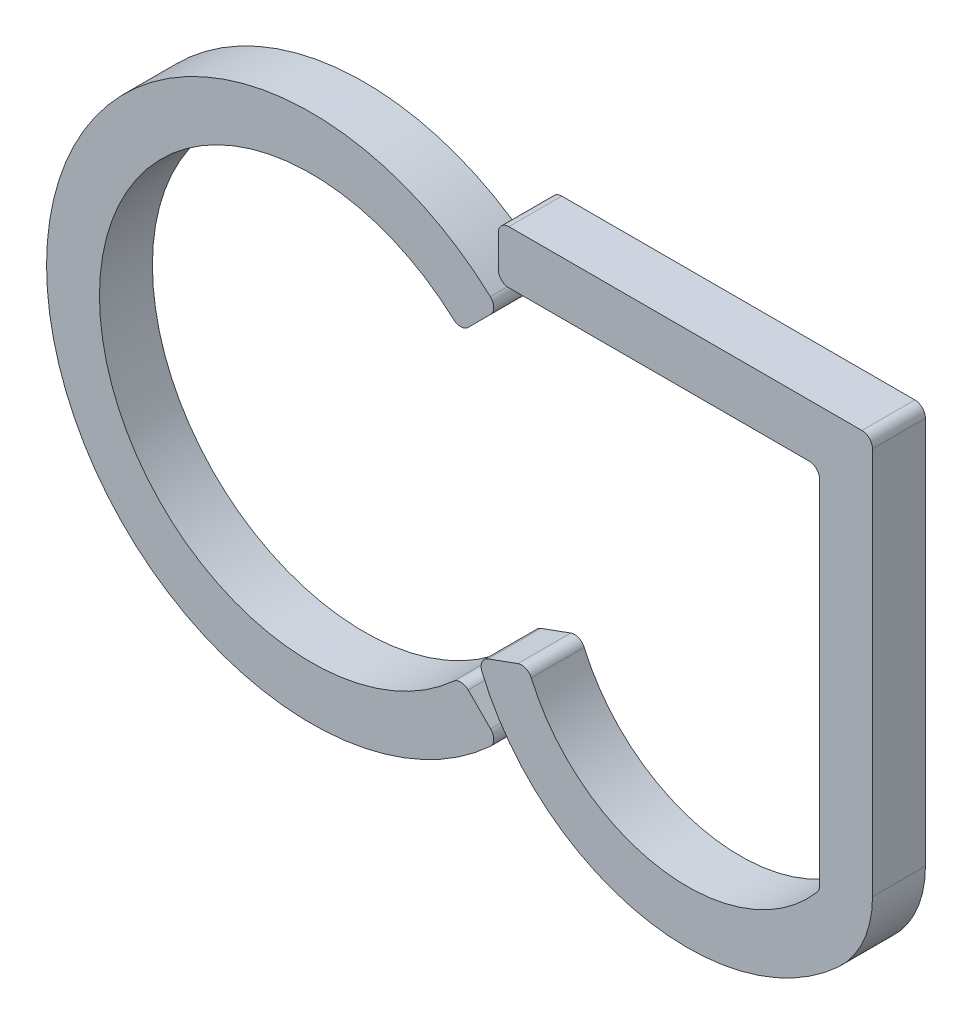
ISO-10303-21;
HEADER;
FILE_DESCRIPTION(('STEP AP214'),'2;1');
FILE_NAME('part.step','',(''),(''),'','','');
FILE_SCHEMA(('AUTOMOTIVE_DESIGN { 1 0 10303 214 1 1 1 1 }'));
ENDSEC;
DATA;
#1=APPLICATION_CONTEXT('core data for automotive mechanical design processes');
#2=APPLICATION_PROTOCOL_DEFINITION('international standard','automotive_design',2000,#1);
#3=PRODUCT_CONTEXT('',#1,'mechanical');
#4=PRODUCT('Part','Part','',(#3));
#5=PRODUCT_RELATED_PRODUCT_CATEGORY('part','',(#4));
#6=PRODUCT_DEFINITION_FORMATION('','',#4);
#7=PRODUCT_DEFINITION_CONTEXT('part definition',#1,'design');
#8=PRODUCT_DEFINITION('design','',#6,#7);
#9=PRODUCT_DEFINITION_SHAPE('','',#8);
#10=(LENGTH_UNIT() NAMED_UNIT(*) SI_UNIT(.MILLI.,.METRE.));
#11=(NAMED_UNIT(*) PLANE_ANGLE_UNIT() SI_UNIT($,.RADIAN.));
#12=(NAMED_UNIT(*) SI_UNIT($,.STERADIAN.) SOLID_ANGLE_UNIT());
#13=UNCERTAINTY_MEASURE_WITH_UNIT(LENGTH_MEASURE(1.E-05),#10,'distance_accuracy_value','');
#14=(GEOMETRIC_REPRESENTATION_CONTEXT(3) GLOBAL_UNCERTAINTY_ASSIGNED_CONTEXT((#13)) GLOBAL_UNIT_ASSIGNED_CONTEXT((#10,
#11,#12)) REPRESENTATION_CONTEXT('',''));
#15=CARTESIAN_POINT('',(0.,0.,0.));
#16=DIRECTION('',(0.,0.,1.));
#17=DIRECTION('',(1.,0.,0.));
#18=AXIS2_PLACEMENT_3D('',#15,#16,#17);
#19=CARTESIAN_POINT('',(106.070861158033,50.,10.));
#20=DIRECTION('',(-1.,0.,0.));
#21=DIRECTION('',(0.,-1.,0.));
#22=AXIS2_PLACEMENT_3D('',#19,#20,#21);
#23=PLANE('',#22);
#24=DIRECTION('',(0.,1.,0.));
#25=VECTOR('',#24,1.);
#26=CARTESIAN_POINT('',(106.070861158033,50.,0.));
#27=LINE('',#26,#25);
#28=CARTESIAN_POINT('',(106.070861158033,-25.2968402151556,0.));
#29=VERTEX_POINT('',#28);
#30=CARTESIAN_POINT('',(106.070861158033,48.,0.));
#31=VERTEX_POINT('',#30);
#32=EDGE_CURVE('E175',#29,#31,#27,.T.);
#33=ORIENTED_EDGE('',*,*,#32,.T.);
#34=DIRECTION('',(0.,0.,-1.));
#35=VECTOR('',#34,1.);
#36=CARTESIAN_POINT('',(106.070861158033,48.,10.));
#37=LINE('',#36,#35);
#38=CARTESIAN_POINT('',(106.070861158033,48.,10.));
#39=VERTEX_POINT('',#38);
#40=EDGE_CURVE('E215',#31,#39,#37,.F.);
#41=ORIENTED_EDGE('',*,*,#40,.T.);
#42=DIRECTION('',(0.,1.,0.));
#43=VECTOR('',#42,1.);
#44=CARTESIAN_POINT('',(106.070861158033,50.,10.));
#45=LINE('',#44,#43);
#46=CARTESIAN_POINT('',(106.070861158033,-25.2968402151556,10.));
#47=VERTEX_POINT('',#46);
#48=EDGE_CURVE('E178',#47,#39,#45,.T.);
#49=ORIENTED_EDGE('',*,*,#48,.F.);
#50=DIRECTION('',(0.,0.,-1.));
#51=VECTOR('',#50,1.);
#52=CARTESIAN_POINT('',(106.070861158033,-25.2968402151556,10.));
#53=LINE('',#52,#51);
#54=EDGE_CURVE('E165',#47,#29,#53,.T.);
#55=ORIENTED_EDGE('',*,*,#54,.T.);
#56=EDGE_LOOP('',(#33,#41,#49,#55));
#57=FACE_BOUND('',#56,.T.);
#58=ADVANCED_FACE('F45',(#57),#23,.F.);
#59=CARTESIAN_POINT('',(35.3553390593273,50.,10.));
#60=DIRECTION('',(0.,-1.,0.));
#61=DIRECTION('',(0.,0.,-1.));
#62=AXIS2_PLACEMENT_3D('',#59,#60,#61);
#63=PLANE('',#62);
#64=DIRECTION('',(-1.,0.,0.));
#65=VECTOR('',#64,1.);
#66=CARTESIAN_POINT('',(35.3553390593273,50.,0.));
#67=LINE('',#66,#65);
#68=CARTESIAN_POINT('',(104.070861158033,50.,0.));
#69=VERTEX_POINT('',#68);
#70=CARTESIAN_POINT('',(37.3553390593273,50.,0.));
#71=VERTEX_POINT('',#70);
#72=EDGE_CURVE('E185',#69,#71,#67,.T.);
#73=ORIENTED_EDGE('',*,*,#72,.T.);
#74=DIRECTION('',(0.,0.,-1.));
#75=VECTOR('',#74,1.);
#76=CARTESIAN_POINT('',(37.3553390593273,50.,10.));
#77=LINE('',#76,#75);
#78=CARTESIAN_POINT('',(37.3553390593273,50.,10.));
#79=VERTEX_POINT('',#78);
#80=EDGE_CURVE('E261',#71,#79,#77,.F.);
#81=ORIENTED_EDGE('',*,*,#80,.T.);
#82=DIRECTION('',(-1.,0.,0.));
#83=VECTOR('',#82,1.);
#84=CARTESIAN_POINT('',(35.3553390593273,50.,10.));
#85=LINE('',#84,#83);
#86=CARTESIAN_POINT('',(104.070861158033,50.,10.));
#87=VERTEX_POINT('',#86);
#88=EDGE_CURVE('E296',#87,#79,#85,.T.);
#89=ORIENTED_EDGE('',*,*,#88,.F.);
#90=DIRECTION('',(0.,0.,-1.));
#91=VECTOR('',#90,1.);
#92=CARTESIAN_POINT('',(104.070861158033,50.,10.));
#93=LINE('',#92,#91);
#94=EDGE_CURVE('E211',#87,#69,#93,.T.);
#95=ORIENTED_EDGE('',*,*,#94,.T.);
#96=EDGE_LOOP('',(#73,#81,#89,#95));
#97=FACE_BOUND('',#96,.T.);
#98=ADVANCED_FACE('F305',(#97),#63,.F.);
#99=CARTESIAN_POINT('',(35.3553390593273,50.,10.));
#100=DIRECTION('',(1.,0.,0.));
#101=DIRECTION('',(0.,0.,-1.));
#102=AXIS2_PLACEMENT_3D('',#99,#100,#101);
#103=PLANE('',#102);
#104=DIRECTION('',(0.,-1.,0.));
#105=VECTOR('',#104,1.);
#106=CARTESIAN_POINT('',(35.3553390593273,50.,0.));
#107=LINE('',#106,#105);
#108=CARTESIAN_POINT('',(35.3553390593273,48.,0.));
#109=VERTEX_POINT('',#108);
#110=CARTESIAN_POINT('',(35.3553390593273,42.,0.));
#111=VERTEX_POINT('',#110);
#112=EDGE_CURVE('E188',#109,#111,#107,.T.);
#113=ORIENTED_EDGE('',*,*,#112,.T.);
#114=DIRECTION('',(0.,0.,-1.));
#115=VECTOR('',#114,1.);
#116=CARTESIAN_POINT('',(35.3553390593273,42.,10.));
#117=LINE('',#116,#115);
#118=CARTESIAN_POINT('',(35.3553390593273,42.,10.));
#119=VERTEX_POINT('',#118);
#120=EDGE_CURVE('E68',#111,#119,#117,.F.);
#121=ORIENTED_EDGE('',*,*,#120,.T.);
#122=DIRECTION('',(0.,-1.,0.));
#123=VECTOR('',#122,1.);
#124=CARTESIAN_POINT('',(35.3553390593273,50.,10.));
#125=LINE('',#124,#123);
#126=CARTESIAN_POINT('',(35.3553390593273,48.,10.));
#127=VERTEX_POINT('',#126);
#128=EDGE_CURVE('E294',#127,#119,#125,.T.);
#129=ORIENTED_EDGE('',*,*,#128,.F.);
#130=DIRECTION('',(0.,0.,-1.));
#131=VECTOR('',#130,1.);
#132=CARTESIAN_POINT('',(35.3553390593273,48.,10.));
#133=LINE('',#132,#131);
#134=EDGE_CURVE('E257',#127,#109,#133,.T.);
#135=ORIENTED_EDGE('',*,*,#134,.T.);
#136=EDGE_LOOP('',(#113,#121,#129,#135));
#137=FACE_BOUND('',#136,.T.);
#138=ADVANCED_FACE('F311',(#137),#103,.F.);
#139=CARTESIAN_POINT('',(35.3553390593273,40.,10.));
#140=DIRECTION('',(0.,1.,0.));
#141=DIRECTION('',(0.,0.,1.));
#142=AXIS2_PLACEMENT_3D('',#139,#140,#141);
#143=PLANE('',#142);
#144=DIRECTION('',(1.,0.,0.));
#145=VECTOR('',#144,1.);
#146=CARTESIAN_POINT('',(35.3553390593273,40.,0.));
#147=LINE('',#146,#145);
#148=CARTESIAN_POINT('',(37.3553390593273,40.,0.));
#149=VERTEX_POINT('',#148);
#150=CARTESIAN_POINT('',(94.0708611580329,40.,0.));
#151=VERTEX_POINT('',#150);
#152=EDGE_CURVE('E194',#149,#151,#147,.T.);
#153=ORIENTED_EDGE('',*,*,#152,.T.);
#154=DIRECTION('',(0.,0.,-1.));
#155=VECTOR('',#154,1.);
#156=CARTESIAN_POINT('',(94.0708611580329,40.,10.));
#157=LINE('',#156,#155);
#158=CARTESIAN_POINT('',(94.0708611580329,40.,10.));
#159=VERTEX_POINT('',#158);
#160=EDGE_CURVE('E227',#151,#159,#157,.F.);
#161=ORIENTED_EDGE('',*,*,#160,.T.);
#162=DIRECTION('',(1.,0.,0.));
#163=VECTOR('',#162,1.);
#164=CARTESIAN_POINT('',(35.3553390593273,40.,10.));
#165=LINE('',#164,#163);
#166=CARTESIAN_POINT('',(37.3553390593273,40.,10.));
#167=VERTEX_POINT('',#166);
#168=EDGE_CURVE('E289',#167,#159,#165,.T.);
#169=ORIENTED_EDGE('',*,*,#168,.F.);
#170=DIRECTION('',(0.,0.,-1.));
#171=VECTOR('',#170,1.);
#172=CARTESIAN_POINT('',(37.3553390593273,40.,10.));
#173=LINE('',#172,#171);
#174=EDGE_CURVE('E224',#167,#149,#173,.T.);
#175=ORIENTED_EDGE('',*,*,#174,.T.);
#176=EDGE_LOOP('',(#153,#161,#169,#175));
#177=FACE_BOUND('',#176,.T.);
#178=ADVANCED_FACE('F319',(#177),#143,.F.);
#179=CARTESIAN_POINT('',(96.0708611580329,40.,10.));
#180=DIRECTION('',(1.,0.,0.));
#181=DIRECTION('',(0.,0.,-1.));
#182=AXIS2_PLACEMENT_3D('',#179,#180,#181);
#183=PLANE('',#182);
#184=DIRECTION('',(0.,-1.,0.));
#185=VECTOR('',#184,1.);
#186=CARTESIAN_POINT('',(96.0708611580329,40.,10.));
#187=LINE('',#186,#185);
#188=CARTESIAN_POINT('',(96.0708611580329,38.,10.));
#189=VERTEX_POINT('',#188);
#190=CARTESIAN_POINT('',(96.0708611580329,-28.4975287566822,10.));
#191=VERTEX_POINT('',#190);
#192=EDGE_CURVE('E283',#189,#191,#187,.T.);
#193=ORIENTED_EDGE('',*,*,#192,.F.);
#194=DIRECTION('',(0.,0.,-1.));
#195=VECTOR('',#194,1.);
#196=CARTESIAN_POINT('',(96.0708611580329,38.,0.));
#197=LINE('',#196,#195);
#198=CARTESIAN_POINT('',(96.0708611580329,38.,0.));
#199=VERTEX_POINT('',#198);
#200=EDGE_CURVE('E221',#189,#199,#197,.T.);
#201=ORIENTED_EDGE('',*,*,#200,.T.);
#202=DIRECTION('',(0.,-1.,0.));
#203=VECTOR('',#202,1.);
#204=CARTESIAN_POINT('',(96.0708611580329,40.,0.));
#205=LINE('',#204,#203);
#206=CARTESIAN_POINT('',(96.0708611580329,-28.4975287566822,0.));
#207=VERTEX_POINT('',#206);
#208=EDGE_CURVE('E197',#199,#207,#205,.T.);
#209=ORIENTED_EDGE('',*,*,#208,.T.);
#210=DIRECTION('',(0.,0.,1.));
#211=VECTOR('',#210,1.);
#212=CARTESIAN_POINT('',(96.0708611580329,-28.4975287566822,10.));
#213=LINE('',#212,#211);
#214=EDGE_CURVE('E219',#207,#191,#213,.T.);
#215=ORIENTED_EDGE('',*,*,#214,.T.);
#216=EDGE_LOOP('',(#193,#201,#209,#215));
#217=FACE_BOUND('',#216,.T.);
#218=ADVANCED_FACE('F273',(#217),#183,.F.);
#219=CARTESIAN_POINT('',(71.0951118170808,-8.98994818030341,10.));
#220=DIRECTION('',(0.,0.,-1.));
#221=DIRECTION('',(-1.,0.,0.));
#222=AXIS2_PLACEMENT_3D('',#219,#220,#221);
#223=CYLINDRICAL_SURFACE('',#222,32.140185097676);
#224=CARTESIAN_POINT('',(71.0951118170808,-8.98994818030341,10.));
#225=DIRECTION('',(0.,0.,-1.));
#226=DIRECTION('',(1.,0.,0.));
#227=AXIS2_PLACEMENT_3D('',#224,#225,#226);
#228=CIRCLE('',#227,32.140185097676);
#229=CARTESIAN_POINT('',(95.5954536093728,-29.7919853443348,10.));
#230=VERTEX_POINT('',#229);
#231=CARTESIAN_POINT('',(41.5890536152692,-21.732947336867,10.));
#232=VERTEX_POINT('',#231);
#233=EDGE_CURVE('E281',#230,#232,#228,.T.);
#234=ORIENTED_EDGE('',*,*,#233,.F.);
#235=DIRECTION('',(0.,0.,-1.));
#236=VECTOR('',#235,1.);
#237=CARTESIAN_POINT('',(95.5954536093728,-29.7919853443348,10.));
#238=LINE('',#237,#236);
#239=CARTESIAN_POINT('',(95.5954536093728,-29.7919853443348,0.));
#240=VERTEX_POINT('',#239);
#241=EDGE_CURVE('E231',#230,#240,#238,.T.);
#242=ORIENTED_EDGE('',*,*,#241,.T.);
#243=CARTESIAN_POINT('',(71.0951118170808,-8.98994818030341,0.));
#244=DIRECTION('',(0.,0.,-1.));
#245=DIRECTION('',(1.,0.,0.));
#246=AXIS2_PLACEMENT_3D('',#243,#244,#245);
#247=CIRCLE('',#246,32.140185097676);
#248=CARTESIAN_POINT('',(41.5890536152692,-21.732947336867,0.));
#249=VERTEX_POINT('',#248);
#250=EDGE_CURVE('E200',#240,#249,#247,.T.);
#251=ORIENTED_EDGE('',*,*,#250,.T.);
#252=DIRECTION('',(0.,0.,-1.));
#253=VECTOR('',#252,1.);
#254=CARTESIAN_POINT('',(41.5890536152692,-21.732947336867,10.));
#255=LINE('',#254,#253);
#256=EDGE_CURVE('E229',#249,#232,#255,.F.);
#257=ORIENTED_EDGE('',*,*,#256,.T.);
#258=EDGE_LOOP('',(#234,#242,#251,#257));
#259=FACE_BOUND('',#258,.T.);
#260=ADVANCED_FACE('F285',(#259),#223,.F.);
#261=CARTESIAN_POINT('',(40.8932170501014,-19.9825388939239,10.));
#262=DIRECTION('',(0.342020143325663,-0.93969262078591,0.));
#263=DIRECTION('',(0.939692620785911,0.342020143325663,0.));
#264=AXIS2_PLACEMENT_3D('',#261,#262,#263);
#265=PLANE('',#264);
#266=DIRECTION('',(-0.93969262078591,-0.342020143325663,0.));
#267=VECTOR('',#266,1.);
#268=CARTESIAN_POINT('',(40.8932170501014,-19.9825388939239,10.));
#269=LINE('',#268,#267);
#270=CARTESIAN_POINT('',(39.0689281839841,-20.6465257398938,10.));
#271=VERTEX_POINT('',#270);
#272=CARTESIAN_POINT('',(33.4225257212233,-22.7016481670261,10.));
#273=VERTEX_POINT('',#272);
#274=EDGE_CURVE('E287',#271,#273,#269,.T.);
#275=ORIENTED_EDGE('',*,*,#274,.F.);
#276=DIRECTION('',(0.,0.,-1.));
#277=VECTOR('',#276,1.);
#278=CARTESIAN_POINT('',(39.0689281839841,-20.6465257398938,10.));
#279=LINE('',#278,#277);
#280=CARTESIAN_POINT('',(39.0689281839841,-20.6465257398938,0.));
#281=VERTEX_POINT('',#280);
#282=EDGE_CURVE('E236',#271,#281,#279,.T.);
#283=ORIENTED_EDGE('',*,*,#282,.T.);
#284=DIRECTION('',(-0.93969262078591,-0.342020143325663,0.));
#285=VECTOR('',#284,1.);
#286=CARTESIAN_POINT('',(40.8932170501014,-19.9825388939239,0.));
#287=LINE('',#286,#285);
#288=CARTESIAN_POINT('',(33.4225257212233,-22.7016481670261,0.));
#289=VERTEX_POINT('',#288);
#290=EDGE_CURVE('E203',#281,#289,#287,.T.);
#291=ORIENTED_EDGE('',*,*,#290,.T.);
#292=DIRECTION('',(0.,0.,-1.));
#293=VECTOR('',#292,1.);
#294=CARTESIAN_POINT('',(33.4225257212233,-22.7016481670261,10.));
#295=LINE('',#294,#293);
#296=EDGE_CURVE('E234',#289,#273,#295,.F.);
#297=ORIENTED_EDGE('',*,*,#296,.T.);
#298=EDGE_LOOP('',(#275,#283,#291,#297));
#299=FACE_BOUND('',#298,.T.);
#300=ADVANCED_FACE('F354',(#299),#265,.F.);
#301=CARTESIAN_POINT('',(71.0951118170808,-8.98994818030341,10.));
#302=DIRECTION('',(0.,0.,-1.));
#303=DIRECTION('',(-1.,0.,0.));
#304=AXIS2_PLACEMENT_3D('',#301,#302,#303);
#305=CYLINDRICAL_SURFACE('',#304,42.140185097676);
#306=CARTESIAN_POINT('',(71.0951118170808,-8.98994818030341,10.));
#307=DIRECTION('',(0.,0.,1.));
#308=DIRECTION('',(1.,0.,0.));
#309=AXIS2_PLACEMENT_3D('',#306,#307,#308);
#310=CIRCLE('',#309,42.140185097676);
#311=CARTESIAN_POINT('',(32.2635976349486,-25.3578651641245,10.));
#312=VERTEX_POINT('',#311);
#313=CARTESIAN_POINT('',(99.5989769121546,-40.0274235078526,10.));
#314=VERTEX_POINT('',#313);
#315=EDGE_CURVE('E179',#312,#314,#310,.T.);
#316=ORIENTED_EDGE('',*,*,#315,.F.);
#317=DIRECTION('',(0.,0.,-1.));
#318=VECTOR('',#317,1.);
#319=CARTESIAN_POINT('',(32.2635976349486,-25.3578651641245,10.));
#320=LINE('',#319,#318);
#321=CARTESIAN_POINT('',(32.2635976349486,-25.3578651641245,0.));
#322=VERTEX_POINT('',#321);
#323=EDGE_CURVE('E254',#312,#322,#320,.T.);
#324=ORIENTED_EDGE('',*,*,#323,.T.);
#325=CARTESIAN_POINT('',(71.0951118170808,-8.98994818030341,0.));
#326=DIRECTION('',(0.,0.,1.));
#327=DIRECTION('',(1.,0.,0.));
#328=AXIS2_PLACEMENT_3D('',#325,#326,#327);
#329=CIRCLE('',#328,42.140185097676);
#330=CARTESIAN_POINT('',(99.5989769121546,-40.0274235078526,0.));
#331=VERTEX_POINT('',#330);
#332=EDGE_CURVE('E206',#322,#331,#329,.T.);
#333=ORIENTED_EDGE('',*,*,#332,.T.);
#334=DIRECTION('',(0.,0.,-1.));
#335=VECTOR('',#334,1.);
#336=CARTESIAN_POINT('',(99.5989769121546,-40.0274235078526,10.));
#337=LINE('',#336,#335);
#338=EDGE_CURVE('E167',#331,#314,#337,.F.);
#339=ORIENTED_EDGE('',*,*,#338,.T.);
#340=EDGE_LOOP('',(#316,#324,#333,#339));
#341=FACE_BOUND('',#340,.T.);
#342=ADVANCED_FACE('F349',(#341),#305,.T.);
#343=CARTESIAN_POINT('',(71.0951118170808,-8.98994818030341,10.));
#344=DIRECTION('',(0.,0.,1.));
#345=DIRECTION('',(1.,0.,0.));
#346=AXIS2_PLACEMENT_3D('',#343,#344,#345);
#347=PLANE('',#346);
#348=ORIENTED_EDGE('',*,*,#233,.T.);
#349=CARTESIAN_POINT('',(39.7529684706354,-22.5259109814656,10.));
#350=DIRECTION('',(0.,0.,1.));
#351=DIRECTION('',(1.,0.,0.));
#352=AXIS2_PLACEMENT_3D('',#349,#350,#351);
#353=CIRCLE('',#352,2.);
#354=EDGE_CURVE('E252',#232,#271,#353,.T.);
#355=ORIENTED_EDGE('',*,*,#354,.T.);
#356=ORIENTED_EDGE('',*,*,#274,.T.);
#357=CARTESIAN_POINT('',(34.1065660078746,-24.5810334085979,10.));
#358=DIRECTION('',(0.,0.,1.));
#359=DIRECTION('',(1.,0.,0.));
#360=AXIS2_PLACEMENT_3D('',#357,#358,#359);
#361=CIRCLE('',#360,2.);
#362=EDGE_CURVE('E60',#273,#312,#361,.T.);
#363=ORIENTED_EDGE('',*,*,#362,.T.);
#364=ORIENTED_EDGE('',*,*,#315,.T.);
#365=CARTESIAN_POINT('',(86.0708611580329,-25.2968402151557,10.));
#366=DIRECTION('',(0.,0.,1.));
#367=DIRECTION('',(1.,0.,0.));
#368=AXIS2_PLACEMENT_3D('',#365,#366,#367);
#369=CIRCLE('',#368,20.);
#370=EDGE_CURVE('E209',#314,#47,#369,.T.);
#371=ORIENTED_EDGE('',*,*,#370,.T.);
#372=ORIENTED_EDGE('',*,*,#48,.T.);
#373=CARTESIAN_POINT('',(104.070861158033,48.,10.));
#374=DIRECTION('',(0.,0.,1.));
#375=DIRECTION('',(1.,0.,0.));
#376=AXIS2_PLACEMENT_3D('',#373,#374,#375);
#377=CIRCLE('',#376,2.);
#378=EDGE_CURVE('E217',#39,#87,#377,.T.);
#379=ORIENTED_EDGE('',*,*,#378,.T.);
#380=ORIENTED_EDGE('',*,*,#88,.T.);
#381=CARTESIAN_POINT('',(37.3553390593273,48.,10.));
#382=DIRECTION('',(0.,0.,1.));
#383=DIRECTION('',(1.,0.,0.));
#384=AXIS2_PLACEMENT_3D('',#381,#382,#383);
#385=CIRCLE('',#384,2.);
#386=EDGE_CURVE('E247',#79,#127,#385,.T.);
#387=ORIENTED_EDGE('',*,*,#386,.T.);
#388=ORIENTED_EDGE('',*,*,#128,.T.);
#389=CARTESIAN_POINT('',(37.3553390593273,42.,10.));
#390=DIRECTION('',(0.,0.,1.));
#391=DIRECTION('',(1.,0.,0.));
#392=AXIS2_PLACEMENT_3D('',#389,#390,#391);
#393=CIRCLE('',#392,2.);
#394=EDGE_CURVE('E249',#119,#167,#393,.T.);
#395=ORIENTED_EDGE('',*,*,#394,.T.);
#396=ORIENTED_EDGE('',*,*,#168,.T.);
#397=CARTESIAN_POINT('',(94.0708611580329,38.,10.));
#398=DIRECTION('',(0.,0.,1.));
#399=DIRECTION('',(1.,0.,0.));
#400=AXIS2_PLACEMENT_3D('',#397,#398,#399);
#401=CIRCLE('',#400,2.);
#402=EDGE_CURVE('E265',#159,#189,#401,.F.);
#403=ORIENTED_EDGE('',*,*,#402,.T.);
#404=ORIENTED_EDGE('',*,*,#192,.T.);
#405=CARTESIAN_POINT('',(94.0708611580329,-28.4975287566822,10.));
#406=DIRECTION('',(0.,0.,1.));
#407=DIRECTION('',(1.,0.,0.));
#408=AXIS2_PLACEMENT_3D('',#405,#406,#407);
#409=CIRCLE('',#408,2.);
#410=EDGE_CURVE('E12',#191,#230,#409,.F.);
#411=ORIENTED_EDGE('',*,*,#410,.T.);
#412=EDGE_LOOP('',(#348,#355,#356,#363,#364,#371,#372,#379,#380,#387,#388,#395,#396,#403,#404,#411));
#413=FACE_BOUND('',#412,.T.);
#414=ADVANCED_FACE('F280',(#413),#347,.T.);
#415=CARTESIAN_POINT('',(71.0951118170808,-8.98994818030341,0.));
#416=DIRECTION('',(0.,0.,1.));
#417=DIRECTION('',(1.,0.,0.));
#418=AXIS2_PLACEMENT_3D('',#415,#416,#417);
#419=PLANE('',#418);
#420=ORIENTED_EDGE('',*,*,#290,.F.);
#421=CARTESIAN_POINT('',(39.7529684706354,-22.5259109814656,0.));
#422=DIRECTION('',(0.,0.,1.));
#423=DIRECTION('',(1.,0.,0.));
#424=AXIS2_PLACEMENT_3D('',#421,#422,#423);
#425=CIRCLE('',#424,2.);
#426=EDGE_CURVE('E245',#281,#249,#425,.F.);
#427=ORIENTED_EDGE('',*,*,#426,.T.);
#428=ORIENTED_EDGE('',*,*,#250,.F.);
#429=CARTESIAN_POINT('',(94.0708611580329,-28.4975287566822,0.));
#430=DIRECTION('',(0.,0.,1.));
#431=DIRECTION('',(1.,0.,0.));
#432=AXIS2_PLACEMENT_3D('',#429,#430,#431);
#433=CIRCLE('',#432,2.);
#434=EDGE_CURVE('E53',#240,#207,#433,.T.);
#435=ORIENTED_EDGE('',*,*,#434,.T.);
#436=ORIENTED_EDGE('',*,*,#208,.F.);
#437=CARTESIAN_POINT('',(94.0708611580329,38.,0.));
#438=DIRECTION('',(0.,0.,1.));
#439=DIRECTION('',(1.,0.,0.));
#440=AXIS2_PLACEMENT_3D('',#437,#438,#439);
#441=CIRCLE('',#440,2.);
#442=EDGE_CURVE('E263',#199,#151,#441,.T.);
#443=ORIENTED_EDGE('',*,*,#442,.T.);
#444=ORIENTED_EDGE('',*,*,#152,.F.);
#445=CARTESIAN_POINT('',(37.3553390593273,42.,0.));
#446=DIRECTION('',(0.,0.,1.));
#447=DIRECTION('',(1.,0.,0.));
#448=AXIS2_PLACEMENT_3D('',#445,#446,#447);
#449=CIRCLE('',#448,2.);
#450=EDGE_CURVE('E241',#149,#111,#449,.F.);
#451=ORIENTED_EDGE('',*,*,#450,.T.);
#452=ORIENTED_EDGE('',*,*,#112,.F.);
#453=CARTESIAN_POINT('',(37.3553390593273,48.,0.));
#454=DIRECTION('',(0.,0.,1.));
#455=DIRECTION('',(1.,0.,0.));
#456=AXIS2_PLACEMENT_3D('',#453,#454,#455);
#457=CIRCLE('',#456,2.);
#458=EDGE_CURVE('E239',#109,#71,#457,.F.);
#459=ORIENTED_EDGE('',*,*,#458,.T.);
#460=ORIENTED_EDGE('',*,*,#72,.F.);
#461=CARTESIAN_POINT('',(104.070861158033,48.,0.));
#462=DIRECTION('',(0.,0.,1.));
#463=DIRECTION('',(1.,0.,0.));
#464=AXIS2_PLACEMENT_3D('',#461,#462,#463);
#465=CIRCLE('',#464,2.);
#466=EDGE_CURVE('E184',#69,#31,#465,.F.);
#467=ORIENTED_EDGE('',*,*,#466,.T.);
#468=ORIENTED_EDGE('',*,*,#32,.F.);
#469=CARTESIAN_POINT('',(86.0708611580329,-25.2968402151557,0.));
#470=DIRECTION('',(0.,0.,1.));
#471=DIRECTION('',(1.,0.,0.));
#472=AXIS2_PLACEMENT_3D('',#469,#470,#471);
#473=CIRCLE('',#472,20.);
#474=EDGE_CURVE('E161',#29,#331,#473,.F.);
#475=ORIENTED_EDGE('',*,*,#474,.T.);
#476=ORIENTED_EDGE('',*,*,#332,.F.);
#477=CARTESIAN_POINT('',(34.1065660078746,-24.5810334085979,0.));
#478=DIRECTION('',(0.,0.,1.));
#479=DIRECTION('',(1.,0.,0.));
#480=AXIS2_PLACEMENT_3D('',#477,#478,#479);
#481=CIRCLE('',#480,2.);
#482=EDGE_CURVE('E243',#322,#289,#481,.F.);
#483=ORIENTED_EDGE('',*,*,#482,.T.);
#484=EDGE_LOOP('',(#420,#427,#428,#435,#436,#443,#444,#451,#452,#459,#460,#467,#468,#475,#476,#483));
#485=FACE_BOUND('',#484,.T.);
#486=ADVANCED_FACE('F182',(#485),#419,.F.);
#487=CARTESIAN_POINT('',(86.0708611580329,-25.2968402151557,10.));
#488=DIRECTION('',(0.,0.,-1.));
#489=DIRECTION('',(-1.,0.,0.));
#490=AXIS2_PLACEMENT_3D('',#487,#488,#489);
#491=CYLINDRICAL_SURFACE('',#490,20.);
#492=ORIENTED_EDGE('',*,*,#370,.F.);
#493=ORIENTED_EDGE('',*,*,#338,.F.);
#494=ORIENTED_EDGE('',*,*,#474,.F.);
#495=ORIENTED_EDGE('',*,*,#54,.F.);
#496=EDGE_LOOP('',(#492,#493,#494,#495));
#497=FACE_BOUND('',#496,.T.);
#498=ADVANCED_FACE('F164',(#497),#491,.T.);
#499=CARTESIAN_POINT('',(104.070861158033,48.,10.));
#500=DIRECTION('',(0.,0.,-1.));
#501=DIRECTION('',(-1.,0.,0.));
#502=AXIS2_PLACEMENT_3D('',#499,#500,#501);
#503=CYLINDRICAL_SURFACE('',#502,2.);
#504=ORIENTED_EDGE('',*,*,#378,.F.);
#505=ORIENTED_EDGE('',*,*,#40,.F.);
#506=ORIENTED_EDGE('',*,*,#466,.F.);
#507=ORIENTED_EDGE('',*,*,#94,.F.);
#508=EDGE_LOOP('',(#504,#505,#506,#507));
#509=FACE_BOUND('',#508,.T.);
#510=ADVANCED_FACE('F303',(#509),#503,.T.);
#511=CARTESIAN_POINT('',(94.0708611580329,38.,10.));
#512=DIRECTION('',(0.,0.,1.));
#513=DIRECTION('',(1.,0.,0.));
#514=AXIS2_PLACEMENT_3D('',#511,#512,#513);
#515=CYLINDRICAL_SURFACE('',#514,2.);
#516=ORIENTED_EDGE('',*,*,#402,.F.);
#517=ORIENTED_EDGE('',*,*,#160,.F.);
#518=ORIENTED_EDGE('',*,*,#442,.F.);
#519=ORIENTED_EDGE('',*,*,#200,.F.);
#520=EDGE_LOOP('',(#516,#517,#518,#519));
#521=FACE_BOUND('',#520,.T.);
#522=ADVANCED_FACE('F323',(#521),#515,.F.);
#523=CARTESIAN_POINT('',(94.0708611580329,-28.4975287566822,10.));
#524=DIRECTION('',(0.,0.,-1.));
#525=DIRECTION('',(-1.,0.,0.));
#526=AXIS2_PLACEMENT_3D('',#523,#524,#525);
#527=CYLINDRICAL_SURFACE('',#526,2.);
#528=ORIENTED_EDGE('',*,*,#410,.F.);
#529=ORIENTED_EDGE('',*,*,#214,.F.);
#530=ORIENTED_EDGE('',*,*,#434,.F.);
#531=ORIENTED_EDGE('',*,*,#241,.F.);
#532=EDGE_LOOP('',(#528,#529,#530,#531));
#533=FACE_BOUND('',#532,.T.);
#534=ADVANCED_FACE('F277',(#533),#527,.F.);
#535=CARTESIAN_POINT('',(39.7529684706354,-22.5259109814656,10.));
#536=DIRECTION('',(0.,0.,-1.));
#537=DIRECTION('',(-1.,0.,0.));
#538=AXIS2_PLACEMENT_3D('',#535,#536,#537);
#539=CYLINDRICAL_SURFACE('',#538,2.);
#540=ORIENTED_EDGE('',*,*,#354,.F.);
#541=ORIENTED_EDGE('',*,*,#256,.F.);
#542=ORIENTED_EDGE('',*,*,#426,.F.);
#543=ORIENTED_EDGE('',*,*,#282,.F.);
#544=EDGE_LOOP('',(#540,#541,#542,#543));
#545=FACE_BOUND('',#544,.T.);
#546=ADVANCED_FACE('F330',(#545),#539,.T.);
#547=CARTESIAN_POINT('',(34.1065660078746,-24.5810334085979,10.));
#548=DIRECTION('',(0.,0.,-1.));
#549=DIRECTION('',(-1.,0.,0.));
#550=AXIS2_PLACEMENT_3D('',#547,#548,#549);
#551=CYLINDRICAL_SURFACE('',#550,2.);
#552=ORIENTED_EDGE('',*,*,#362,.F.);
#553=ORIENTED_EDGE('',*,*,#296,.F.);
#554=ORIENTED_EDGE('',*,*,#482,.F.);
#555=ORIENTED_EDGE('',*,*,#323,.F.);
#556=EDGE_LOOP('',(#552,#553,#554,#555));
#557=FACE_BOUND('',#556,.T.);
#558=ADVANCED_FACE('F418',(#557),#551,.T.);
#559=CARTESIAN_POINT('',(37.3553390593273,42.,10.));
#560=DIRECTION('',(0.,0.,-1.));
#561=DIRECTION('',(-1.,0.,0.));
#562=AXIS2_PLACEMENT_3D('',#559,#560,#561);
#563=CYLINDRICAL_SURFACE('',#562,2.);
#564=ORIENTED_EDGE('',*,*,#394,.F.);
#565=ORIENTED_EDGE('',*,*,#120,.F.);
#566=ORIENTED_EDGE('',*,*,#450,.F.);
#567=ORIENTED_EDGE('',*,*,#174,.F.);
#568=EDGE_LOOP('',(#564,#565,#566,#567));
#569=FACE_BOUND('',#568,.T.);
#570=ADVANCED_FACE('F316',(#569),#563,.T.);
#571=CARTESIAN_POINT('',(37.3553390593273,48.,10.));
#572=DIRECTION('',(0.,0.,-1.));
#573=DIRECTION('',(-1.,0.,0.));
#574=AXIS2_PLACEMENT_3D('',#571,#572,#573);
#575=CYLINDRICAL_SURFACE('',#574,2.);
#576=ORIENTED_EDGE('',*,*,#386,.F.);
#577=ORIENTED_EDGE('',*,*,#80,.F.);
#578=ORIENTED_EDGE('',*,*,#458,.F.);
#579=ORIENTED_EDGE('',*,*,#134,.F.);
#580=EDGE_LOOP('',(#576,#577,#578,#579));
#581=FACE_BOUND('',#580,.T.);
#582=ADVANCED_FACE('F47',(#581),#575,.T.);
#583=CLOSED_SHELL('',(#58,#98,#138,#178,#218,#260,#300,#342,#414,#486,#498,#510,#522,#534,#546,
#558,#570,#582));
#584=MANIFOLD_SOLID_BREP('B2',#583);
#585=CARTESIAN_POINT('',(0.,0.,10.));
#586=DIRECTION('',(0.,0.,-1.));
#587=DIRECTION('',(-1.,0.,0.));
#588=AXIS2_PLACEMENT_3D('',#585,#586,#587);
#589=CYLINDRICAL_SURFACE('',#588,40.);
#590=CARTESIAN_POINT('',(0.,0.,0.));
#591=DIRECTION('',(0.,0.,-1.));
#592=DIRECTION('',(1.,0.,0.));
#593=AXIS2_PLACEMENT_3D('',#590,#591,#592);
#594=CIRCLE('',#593,40.);
#595=CARTESIAN_POINT('',(26.9053146533422,-29.5990547721486,0.));
#596=VERTEX_POINT('',#595);
#597=CARTESIAN_POINT('',(26.9053146533424,29.5990547721484,0.));
#598=VERTEX_POINT('',#597);
#599=EDGE_CURVE('E574',#596,#598,#594,.T.);
#600=ORIENTED_EDGE('',*,*,#599,.T.);
#601=DIRECTION('',(0.,0.,-1.));
#602=VECTOR('',#601,1.);
#603=CARTESIAN_POINT('',(26.9053146533424,29.5990547721484,10.));
#604=LINE('',#603,#602);
#605=CARTESIAN_POINT('',(26.9053146533424,29.5990547721484,10.));
#606=VERTEX_POINT('',#605);
#607=EDGE_CURVE('E552',#598,#606,#604,.F.);
#608=ORIENTED_EDGE('',*,*,#607,.T.);
#609=CARTESIAN_POINT('',(0.,0.,10.));
#610=DIRECTION('',(0.,0.,-1.));
#611=DIRECTION('',(1.,0.,0.));
#612=AXIS2_PLACEMENT_3D('',#609,#610,#611);
#613=CIRCLE('',#612,40.);
#614=CARTESIAN_POINT('',(26.9053146533422,-29.5990547721486,10.));
#615=VERTEX_POINT('',#614);
#616=EDGE_CURVE('E583',#615,#606,#613,.T.);
#617=ORIENTED_EDGE('',*,*,#616,.F.);
#618=DIRECTION('',(0.,0.,-1.));
#619=VECTOR('',#618,1.);
#620=CARTESIAN_POINT('',(26.9053146533422,-29.5990547721486,10.));
#621=LINE('',#620,#619);
#622=EDGE_CURVE('E557',#615,#596,#621,.T.);
#623=ORIENTED_EDGE('',*,*,#622,.T.);
#624=EDGE_LOOP('',(#600,#608,#617,#623));
#625=FACE_BOUND('',#624,.T.);
#626=ADVANCED_FACE('F481',(#625),#589,.F.);
#627=CARTESIAN_POINT('',(28.2842712474618,28.284271247462,10.));
#628=DIRECTION('',(-0.707106781186549,0.707106781186546,0.));
#629=DIRECTION('',(-0.707106781186546,-0.707106781186549,0.));
#630=AXIS2_PLACEMENT_3D('',#627,#628,#629);
#631=PLANE('',#630);
#632=DIRECTION('',(0.707106781186546,0.707106781186549,0.));
#633=VECTOR('',#632,1.);
#634=CARTESIAN_POINT('',(28.2842712474618,28.284271247462,10.));
#635=LINE('',#634,#633);
#636=CARTESIAN_POINT('',(29.6647939483826,29.6647939483827,10.));
#637=VERTEX_POINT('',#636);
#638=CARTESIAN_POINT('',(33.9116499156263,33.9116499156264,10.));
#639=VERTEX_POINT('',#638);
#640=EDGE_CURVE('E567',#637,#639,#635,.T.);
#641=ORIENTED_EDGE('',*,*,#640,.F.);
#642=DIRECTION('',(0.,0.,-1.));
#643=VECTOR('',#642,1.);
#644=CARTESIAN_POINT('',(29.6647939483826,29.6647939483827,10.));
#645=LINE('',#644,#643);
#646=CARTESIAN_POINT('',(29.6647939483826,29.6647939483827,0.));
#647=VERTEX_POINT('',#646);
#648=EDGE_CURVE('E551',#637,#647,#645,.T.);
#649=ORIENTED_EDGE('',*,*,#648,.T.);
#650=DIRECTION('',(0.707106781186546,0.707106781186549,0.));
#651=VECTOR('',#650,1.);
#652=CARTESIAN_POINT('',(28.2842712474618,28.284271247462,0.));
#653=LINE('',#652,#651);
#654=CARTESIAN_POINT('',(33.9116499156263,33.9116499156264,0.));
#655=VERTEX_POINT('',#654);
#656=EDGE_CURVE('E564',#647,#655,#653,.T.);
#657=ORIENTED_EDGE('',*,*,#656,.T.);
#658=DIRECTION('',(0.,0.,-1.));
#659=VECTOR('',#658,1.);
#660=CARTESIAN_POINT('',(33.9116499156263,33.9116499156264,10.));
#661=LINE('',#660,#659);
#662=EDGE_CURVE('E569',#655,#639,#661,.F.);
#663=ORIENTED_EDGE('',*,*,#662,.T.);
#664=EDGE_LOOP('',(#641,#649,#657,#663));
#665=FACE_BOUND('',#664,.T.);
#666=ADVANCED_FACE('F563',(#665),#631,.F.);
#667=CARTESIAN_POINT('',(0.,0.,10.));
#668=DIRECTION('',(0.,0.,-1.));
#669=DIRECTION('',(-1.,0.,0.));
#670=AXIS2_PLACEMENT_3D('',#667,#668,#669);
#671=CYLINDRICAL_SURFACE('',#670,50.);
#672=CARTESIAN_POINT('',(0.,0.,10.));
#673=DIRECTION('',(0.,0.,1.));
#674=DIRECTION('',(1.,0.,0.));
#675=AXIS2_PLACEMENT_3D('',#672,#673,#674);
#676=CIRCLE('',#675,50.);
#677=CARTESIAN_POINT('',(33.8514962013054,36.7977744562495,10.));
#678=VERTEX_POINT('',#677);
#679=CARTESIAN_POINT('',(33.8514962013051,-36.7977744562497,10.));
#680=VERTEX_POINT('',#679);
#681=EDGE_CURVE('E609',#678,#680,#676,.T.);
#682=ORIENTED_EDGE('',*,*,#681,.F.);
#683=DIRECTION('',(0.,0.,-1.));
#684=VECTOR('',#683,1.);
#685=CARTESIAN_POINT('',(33.8514962013054,36.7977744562495,10.));
#686=LINE('',#685,#684);
#687=CARTESIAN_POINT('',(33.8514962013054,36.7977744562495,0.));
#688=VERTEX_POINT('',#687);
#689=EDGE_CURVE('E602',#678,#688,#686,.T.);
#690=ORIENTED_EDGE('',*,*,#689,.T.);
#691=CARTESIAN_POINT('',(0.,0.,0.));
#692=DIRECTION('',(0.,0.,1.));
#693=DIRECTION('',(1.,0.,0.));
#694=AXIS2_PLACEMENT_3D('',#691,#692,#693);
#695=CIRCLE('',#694,50.);
#696=CARTESIAN_POINT('',(33.8514962013051,-36.7977744562497,0.));
#697=VERTEX_POINT('',#696);
#698=EDGE_CURVE('E573',#688,#697,#695,.T.);
#699=ORIENTED_EDGE('',*,*,#698,.T.);
#700=DIRECTION('',(0.,0.,-1.));
#701=VECTOR('',#700,1.);
#702=CARTESIAN_POINT('',(33.8514962013051,-36.7977744562497,10.));
#703=LINE('',#702,#701);
#704=EDGE_CURVE('E600',#697,#680,#703,.F.);
#705=ORIENTED_EDGE('',*,*,#704,.T.);
#706=EDGE_LOOP('',(#682,#690,#699,#705));
#707=FACE_BOUND('',#706,.T.);
#708=ADVANCED_FACE('F607',(#707),#671,.T.);
#709=CARTESIAN_POINT('',(35.3553390593271,-35.3553390593277,10.));
#710=DIRECTION('',(-0.707106781186553,-0.707106781186542,0.));
#711=DIRECTION('',(0.707106781186542,-0.707106781186553,0.));
#712=AXIS2_PLACEMENT_3D('',#709,#710,#711);
#713=PLANE('',#712);
#714=DIRECTION('',(-0.707106781186542,0.707106781186553,0.));
#715=VECTOR('',#714,1.);
#716=CARTESIAN_POINT('',(35.3553390593271,-35.3553390593277,10.));
#717=LINE('',#716,#715);
#718=CARTESIAN_POINT('',(33.911649915626,-33.9116499156266,10.));
#719=VERTEX_POINT('',#718);
#720=CARTESIAN_POINT('',(29.6647939483824,-29.6647939483829,10.));
#721=VERTEX_POINT('',#720);
#722=EDGE_CURVE('E584',#719,#721,#717,.T.);
#723=ORIENTED_EDGE('',*,*,#722,.F.);
#724=DIRECTION('',(0.,0.,-1.));
#725=VECTOR('',#724,1.);
#726=CARTESIAN_POINT('',(33.911649915626,-33.9116499156266,10.));
#727=LINE('',#726,#725);
#728=CARTESIAN_POINT('',(33.911649915626,-33.9116499156266,0.));
#729=VERTEX_POINT('',#728);
#730=EDGE_CURVE('E43',#719,#729,#727,.T.);
#731=ORIENTED_EDGE('',*,*,#730,.T.);
#732=DIRECTION('',(-0.707106781186542,0.707106781186553,0.));
#733=VECTOR('',#732,1.);
#734=CARTESIAN_POINT('',(35.3553390593271,-35.3553390593277,0.));
#735=LINE('',#734,#733);
#736=CARTESIAN_POINT('',(29.6647939483824,-29.6647939483829,0.));
#737=VERTEX_POINT('',#736);
#738=EDGE_CURVE('E577',#729,#737,#735,.T.);
#739=ORIENTED_EDGE('',*,*,#738,.T.);
#740=DIRECTION('',(0.,0.,-1.));
#741=VECTOR('',#740,1.);
#742=CARTESIAN_POINT('',(29.6647939483824,-29.6647939483829,10.));
#743=LINE('',#742,#741);
#744=EDGE_CURVE('E489',#737,#721,#743,.F.);
#745=ORIENTED_EDGE('',*,*,#744,.T.);
#746=EDGE_LOOP('',(#723,#731,#739,#745));
#747=FACE_BOUND('',#746,.T.);
#748=ADVANCED_FACE('F616',(#747),#713,.F.);
#749=CARTESIAN_POINT('',(0.,0.,10.));
#750=DIRECTION('',(0.,0.,1.));
#751=DIRECTION('',(1.,0.,0.));
#752=AXIS2_PLACEMENT_3D('',#749,#750,#751);
#753=PLANE('',#752);
#754=ORIENTED_EDGE('',*,*,#616,.T.);
#755=CARTESIAN_POINT('',(28.2505803860095,31.0790075107558,10.));
#756=DIRECTION('',(0.,0.,1.));
#757=DIRECTION('',(1.,0.,0.));
#758=AXIS2_PLACEMENT_3D('',#755,#756,#757);
#759=CIRCLE('',#758,2.);
#760=EDGE_CURVE('E598',#606,#637,#759,.T.);
#761=ORIENTED_EDGE('',*,*,#760,.T.);
#762=ORIENTED_EDGE('',*,*,#640,.T.);
#763=CARTESIAN_POINT('',(32.4974363532532,35.3258634779995,10.));
#764=DIRECTION('',(0.,0.,1.));
#765=DIRECTION('',(1.,0.,0.));
#766=AXIS2_PLACEMENT_3D('',#763,#764,#765);
#767=CIRCLE('',#766,2.);
#768=EDGE_CURVE('E596',#639,#678,#767,.T.);
#769=ORIENTED_EDGE('',*,*,#768,.T.);
#770=ORIENTED_EDGE('',*,*,#681,.T.);
#771=CARTESIAN_POINT('',(32.4974363532529,-35.3258634779997,10.));
#772=DIRECTION('',(0.,0.,1.));
#773=DIRECTION('',(1.,0.,0.));
#774=AXIS2_PLACEMENT_3D('',#771,#772,#773);
#775=CIRCLE('',#774,2.);
#776=EDGE_CURVE('E502',#680,#719,#775,.T.);
#777=ORIENTED_EDGE('',*,*,#776,.T.);
#778=ORIENTED_EDGE('',*,*,#722,.T.);
#779=CARTESIAN_POINT('',(28.2505803860093,-31.079007510756,10.));
#780=DIRECTION('',(0.,0.,1.));
#781=DIRECTION('',(1.,0.,0.));
#782=AXIS2_PLACEMENT_3D('',#779,#780,#781);
#783=CIRCLE('',#782,2.);
#784=EDGE_CURVE('E593',#721,#615,#783,.T.);
#785=ORIENTED_EDGE('',*,*,#784,.T.);
#786=EDGE_LOOP('',(#754,#761,#762,#769,#770,#777,#778,#785));
#787=FACE_BOUND('',#786,.T.);
#788=ADVANCED_FACE('F623',(#787),#753,.T.);
#789=CARTESIAN_POINT('',(0.,0.,0.));
#790=DIRECTION('',(0.,0.,1.));
#791=DIRECTION('',(1.,0.,0.));
#792=AXIS2_PLACEMENT_3D('',#789,#790,#791);
#793=PLANE('',#792);
#794=ORIENTED_EDGE('',*,*,#656,.F.);
#795=CARTESIAN_POINT('',(28.2505803860095,31.0790075107558,0.));
#796=DIRECTION('',(0.,0.,1.));
#797=DIRECTION('',(1.,0.,0.));
#798=AXIS2_PLACEMENT_3D('',#795,#796,#797);
#799=CIRCLE('',#798,2.);
#800=EDGE_CURVE('E547',#647,#598,#799,.F.);
#801=ORIENTED_EDGE('',*,*,#800,.T.);
#802=ORIENTED_EDGE('',*,*,#599,.F.);
#803=CARTESIAN_POINT('',(28.2505803860093,-31.079007510756,0.));
#804=DIRECTION('',(0.,0.,1.));
#805=DIRECTION('',(1.,0.,0.));
#806=AXIS2_PLACEMENT_3D('',#803,#804,#805);
#807=CIRCLE('',#806,2.);
#808=EDGE_CURVE('E568',#596,#737,#807,.F.);
#809=ORIENTED_EDGE('',*,*,#808,.T.);
#810=ORIENTED_EDGE('',*,*,#738,.F.);
#811=CARTESIAN_POINT('',(32.4974363532529,-35.3258634779997,0.));
#812=DIRECTION('',(0.,0.,1.));
#813=DIRECTION('',(1.,0.,0.));
#814=AXIS2_PLACEMENT_3D('',#811,#812,#813);
#815=CIRCLE('',#814,2.);
#816=EDGE_CURVE('E587',#729,#697,#815,.F.);
#817=ORIENTED_EDGE('',*,*,#816,.T.);
#818=ORIENTED_EDGE('',*,*,#698,.F.);
#819=CARTESIAN_POINT('',(32.4974363532532,35.3258634779995,0.));
#820=DIRECTION('',(0.,0.,1.));
#821=DIRECTION('',(1.,0.,0.));
#822=AXIS2_PLACEMENT_3D('',#819,#820,#821);
#823=CIRCLE('',#822,2.);
#824=EDGE_CURVE('E558',#688,#655,#823,.F.);
#825=ORIENTED_EDGE('',*,*,#824,.T.);
#826=EDGE_LOOP('',(#794,#801,#802,#809,#810,#817,#818,#825));
#827=FACE_BOUND('',#826,.T.);
#828=ADVANCED_FACE('F571',(#827),#793,.F.);
#829=CARTESIAN_POINT('',(28.2505803860095,31.0790075107558,10.));
#830=DIRECTION('',(0.,0.,-1.));
#831=DIRECTION('',(-1.,0.,0.));
#832=AXIS2_PLACEMENT_3D('',#829,#830,#831);
#833=CYLINDRICAL_SURFACE('',#832,2.);
#834=ORIENTED_EDGE('',*,*,#760,.F.);
#835=ORIENTED_EDGE('',*,*,#607,.F.);
#836=ORIENTED_EDGE('',*,*,#800,.F.);
#837=ORIENTED_EDGE('',*,*,#648,.F.);
#838=EDGE_LOOP('',(#834,#835,#836,#837));
#839=FACE_BOUND('',#838,.T.);
#840=ADVANCED_FACE('F550',(#839),#833,.T.);
#841=CARTESIAN_POINT('',(32.4974363532532,35.3258634779995,10.));
#842=DIRECTION('',(0.,0.,-1.));
#843=DIRECTION('',(-1.,0.,0.));
#844=AXIS2_PLACEMENT_3D('',#841,#842,#843);
#845=CYLINDRICAL_SURFACE('',#844,2.);
#846=ORIENTED_EDGE('',*,*,#768,.F.);
#847=ORIENTED_EDGE('',*,*,#662,.F.);
#848=ORIENTED_EDGE('',*,*,#824,.F.);
#849=ORIENTED_EDGE('',*,*,#689,.F.);
#850=EDGE_LOOP('',(#846,#847,#848,#849));
#851=FACE_BOUND('',#850,.T.);
#852=ADVANCED_FACE('F631',(#851),#845,.T.);
#853=CARTESIAN_POINT('',(32.4974363532529,-35.3258634779997,10.));
#854=DIRECTION('',(0.,0.,-1.));
#855=DIRECTION('',(-1.,0.,0.));
#856=AXIS2_PLACEMENT_3D('',#853,#854,#855);
#857=CYLINDRICAL_SURFACE('',#856,2.);
#858=ORIENTED_EDGE('',*,*,#776,.F.);
#859=ORIENTED_EDGE('',*,*,#704,.F.);
#860=ORIENTED_EDGE('',*,*,#816,.F.);
#861=ORIENTED_EDGE('',*,*,#730,.F.);
#862=EDGE_LOOP('',(#858,#859,#860,#861));
#863=FACE_BOUND('',#862,.T.);
#864=ADVANCED_FACE('F615',(#863),#857,.T.);
#865=CARTESIAN_POINT('',(28.2505803860093,-31.079007510756,10.));
#866=DIRECTION('',(0.,0.,-1.));
#867=DIRECTION('',(-1.,0.,0.));
#868=AXIS2_PLACEMENT_3D('',#865,#866,#867);
#869=CYLINDRICAL_SURFACE('',#868,2.);
#870=ORIENTED_EDGE('',*,*,#784,.F.);
#871=ORIENTED_EDGE('',*,*,#744,.F.);
#872=ORIENTED_EDGE('',*,*,#808,.F.);
#873=ORIENTED_EDGE('',*,*,#622,.F.);
#874=EDGE_LOOP('',(#870,#871,#872,#873));
#875=FACE_BOUND('',#874,.T.);
#876=ADVANCED_FACE('F483',(#875),#869,.T.);
#877=CLOSED_SHELL('',(#626,#666,#708,#748,#788,#828,#840,#852,#864,#876));
#878=MANIFOLD_SOLID_BREP('B6',#877);
#879=ADVANCED_BREP_SHAPE_REPRESENTATION('',(#18,#584,#878),#14);
#880=SHAPE_DEFINITION_REPRESENTATION(#9,#879);
ENDSEC;
END-ISO-10303-21;
